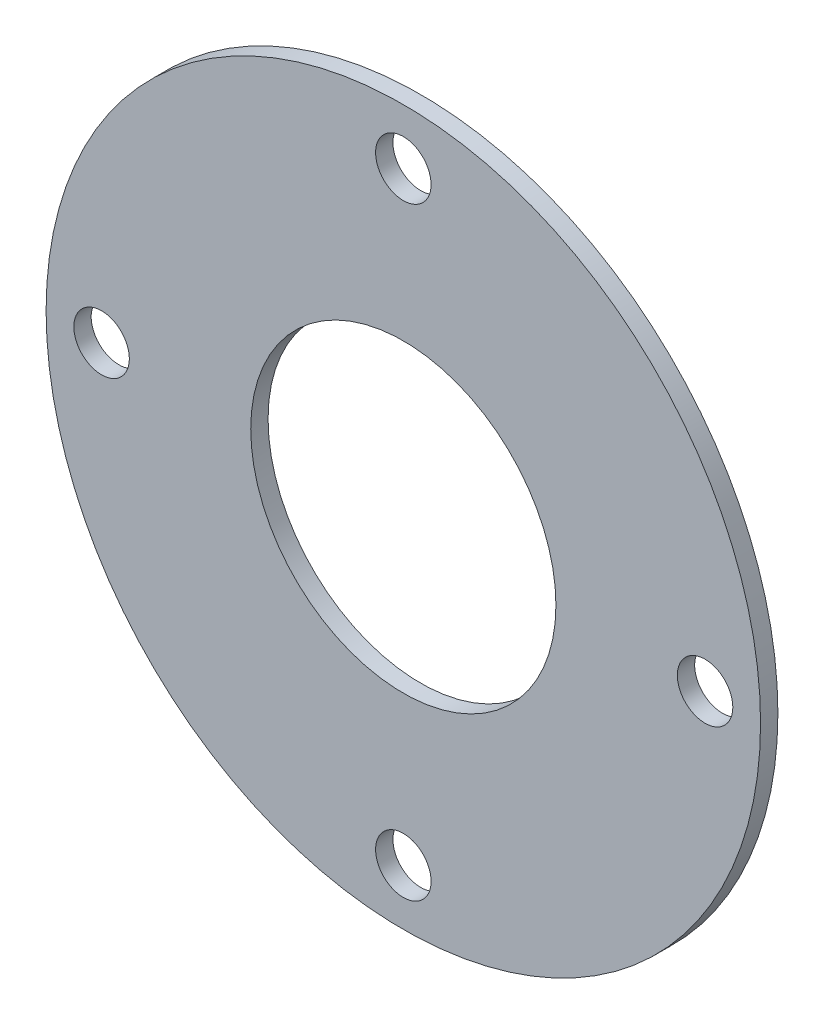
ISO-10303-21;
HEADER;
FILE_DESCRIPTION(('STEP AP214'),'2;1');
FILE_NAME('part.step','',(''),(''),'','','');
FILE_SCHEMA(('AUTOMOTIVE_DESIGN { 1 0 10303 214 1 1 1 1 }'));
ENDSEC;
DATA;
#1=APPLICATION_CONTEXT('core data for automotive mechanical design processes');
#2=APPLICATION_PROTOCOL_DEFINITION('international standard','automotive_design',2000,#1);
#3=PRODUCT_CONTEXT('',#1,'mechanical');
#4=PRODUCT('Part','Part','',(#3));
#5=PRODUCT_RELATED_PRODUCT_CATEGORY('part','',(#4));
#6=PRODUCT_DEFINITION_FORMATION('','',#4);
#7=PRODUCT_DEFINITION_CONTEXT('part definition',#1,'design');
#8=PRODUCT_DEFINITION('design','',#6,#7);
#9=PRODUCT_DEFINITION_SHAPE('','',#8);
#10=(LENGTH_UNIT() NAMED_UNIT(*) SI_UNIT(.MILLI.,.METRE.));
#11=(NAMED_UNIT(*) PLANE_ANGLE_UNIT() SI_UNIT($,.RADIAN.));
#12=(NAMED_UNIT(*) SI_UNIT($,.STERADIAN.) SOLID_ANGLE_UNIT());
#13=UNCERTAINTY_MEASURE_WITH_UNIT(LENGTH_MEASURE(1.E-05),#10,'distance_accuracy_value','');
#14=(GEOMETRIC_REPRESENTATION_CONTEXT(3) GLOBAL_UNCERTAINTY_ASSIGNED_CONTEXT((#13)) GLOBAL_UNIT_ASSIGNED_CONTEXT((#10,
#11,#12)) REPRESENTATION_CONTEXT('',''));
#15=CARTESIAN_POINT('',(0.,0.,0.));
#16=DIRECTION('',(0.,0.,1.));
#17=DIRECTION('',(1.,0.,0.));
#18=AXIS2_PLACEMENT_3D('',#15,#16,#17);
#19=CARTESIAN_POINT('',(0.,0.,29.5));
#20=DIRECTION('',(0.,0.,1.));
#21=DIRECTION('',(1.,0.,0.));
#22=AXIS2_PLACEMENT_3D('',#19,#20,#21);
#23=PLANE('',#22);
#24=CARTESIAN_POINT('',(43.5,0.,29.5));
#25=DIRECTION('',(0.,0.,1.));
#26=DIRECTION('',(1.,0.,0.));
#27=AXIS2_PLACEMENT_3D('',#24,#25,#26);
#28=CIRCLE('',#27,4.);
#29=CARTESIAN_POINT('',(47.5,0.,29.5));
#30=VERTEX_POINT('',#29);
#31=EDGE_CURVE('E85',#30,#30,#28,.T.);
#32=ORIENTED_EDGE('',*,*,#31,.F.);
#33=EDGE_LOOP('',(#32));
#34=FACE_BOUND('',#33,.T.);
#35=CARTESIAN_POINT('',(0.,43.5,29.5));
#36=DIRECTION('',(0.,0.,1.));
#37=DIRECTION('',(1.,0.,0.));
#38=AXIS2_PLACEMENT_3D('',#35,#36,#37);
#39=CIRCLE('',#38,4.);
#40=CARTESIAN_POINT('',(4.,43.5,29.5));
#41=VERTEX_POINT('',#40);
#42=EDGE_CURVE('E69',#41,#41,#39,.T.);
#43=ORIENTED_EDGE('',*,*,#42,.F.);
#44=EDGE_LOOP('',(#43));
#45=FACE_BOUND('',#44,.T.);
#46=CARTESIAN_POINT('',(-43.5,0.,29.5));
#47=DIRECTION('',(0.,0.,1.));
#48=DIRECTION('',(1.,0.,0.));
#49=AXIS2_PLACEMENT_3D('',#46,#47,#48);
#50=CIRCLE('',#49,4.);
#51=CARTESIAN_POINT('',(-39.5,0.,29.5));
#52=VERTEX_POINT('',#51);
#53=EDGE_CURVE('E65',#52,#52,#50,.T.);
#54=ORIENTED_EDGE('',*,*,#53,.F.);
#55=EDGE_LOOP('',(#54));
#56=FACE_BOUND('',#55,.T.);
#57=CARTESIAN_POINT('',(0.,-43.5,29.5));
#58=DIRECTION('',(0.,0.,1.));
#59=DIRECTION('',(1.,0.,0.));
#60=AXIS2_PLACEMENT_3D('',#57,#58,#59);
#61=CIRCLE('',#60,4.);
#62=CARTESIAN_POINT('',(3.99999999999999,-43.5,29.5));
#63=VERTEX_POINT('',#62);
#64=EDGE_CURVE('E62',#63,#63,#61,.T.);
#65=ORIENTED_EDGE('',*,*,#64,.F.);
#66=EDGE_LOOP('',(#65));
#67=FACE_BOUND('',#66,.T.);
#68=CARTESIAN_POINT('',(0.,0.,29.5));
#69=DIRECTION('',(0.,0.,1.));
#70=DIRECTION('',(1.,0.,0.));
#71=AXIS2_PLACEMENT_3D('',#68,#69,#70);
#72=CIRCLE('',#71,51.5);
#73=CARTESIAN_POINT('',(51.5,0.,29.5));
#74=VERTEX_POINT('',#73);
#75=EDGE_CURVE('E10',#74,#74,#72,.T.);
#76=ORIENTED_EDGE('',*,*,#75,.T.);
#77=EDGE_LOOP('',(#76));
#78=FACE_BOUND('',#77,.T.);
#79=CARTESIAN_POINT('',(0.,0.,29.5));
#80=DIRECTION('',(0.,0.,1.));
#81=DIRECTION('',(1.,0.,0.));
#82=AXIS2_PLACEMENT_3D('',#79,#80,#81);
#83=CIRCLE('',#82,22.);
#84=CARTESIAN_POINT('',(22.,0.,29.5));
#85=VERTEX_POINT('',#84);
#86=EDGE_CURVE('E53',#85,#85,#83,.T.);
#87=ORIENTED_EDGE('',*,*,#86,.F.);
#88=EDGE_LOOP('',(#87));
#89=FACE_BOUND('',#88,.T.);
#90=ADVANCED_FACE('F36',(#34,#45,#56,#67,#78,#89),#23,.T.);
#91=CARTESIAN_POINT('',(0.,0.,27.));
#92=DIRECTION('',(0.,0.,1.));
#93=DIRECTION('',(1.,0.,0.));
#94=AXIS2_PLACEMENT_3D('',#91,#92,#93);
#95=PLANE('',#94);
#96=CARTESIAN_POINT('',(43.5,0.,27.));
#97=DIRECTION('',(0.,0.,1.));
#98=DIRECTION('',(1.,0.,0.));
#99=AXIS2_PLACEMENT_3D('',#96,#97,#98);
#100=CIRCLE('',#99,4.);
#101=CARTESIAN_POINT('',(47.5,0.,27.));
#102=VERTEX_POINT('',#101);
#103=EDGE_CURVE('E40',#102,#102,#100,.T.);
#104=ORIENTED_EDGE('',*,*,#103,.T.);
#105=EDGE_LOOP('',(#104));
#106=FACE_BOUND('',#105,.T.);
#107=CARTESIAN_POINT('',(0.,43.5,27.));
#108=DIRECTION('',(0.,0.,1.));
#109=DIRECTION('',(1.,0.,0.));
#110=AXIS2_PLACEMENT_3D('',#107,#108,#109);
#111=CIRCLE('',#110,4.);
#112=CARTESIAN_POINT('',(4.,43.5,27.));
#113=VERTEX_POINT('',#112);
#114=EDGE_CURVE('E66',#113,#113,#111,.T.);
#115=ORIENTED_EDGE('',*,*,#114,.T.);
#116=EDGE_LOOP('',(#115));
#117=FACE_BOUND('',#116,.T.);
#118=CARTESIAN_POINT('',(-43.5,0.,27.));
#119=DIRECTION('',(0.,0.,1.));
#120=DIRECTION('',(1.,0.,0.));
#121=AXIS2_PLACEMENT_3D('',#118,#119,#120);
#122=CIRCLE('',#121,4.);
#123=CARTESIAN_POINT('',(-39.5,0.,27.));
#124=VERTEX_POINT('',#123);
#125=EDGE_CURVE('E63',#124,#124,#122,.T.);
#126=ORIENTED_EDGE('',*,*,#125,.T.);
#127=EDGE_LOOP('',(#126));
#128=FACE_BOUND('',#127,.T.);
#129=CARTESIAN_POINT('',(0.,-43.5,27.));
#130=DIRECTION('',(0.,0.,1.));
#131=DIRECTION('',(1.,0.,0.));
#132=AXIS2_PLACEMENT_3D('',#129,#130,#131);
#133=CIRCLE('',#132,4.);
#134=CARTESIAN_POINT('',(3.99999999999999,-43.5,27.));
#135=VERTEX_POINT('',#134);
#136=EDGE_CURVE('E59',#135,#135,#133,.T.);
#137=ORIENTED_EDGE('',*,*,#136,.T.);
#138=EDGE_LOOP('',(#137));
#139=FACE_BOUND('',#138,.T.);
#140=CARTESIAN_POINT('',(0.,0.,27.));
#141=DIRECTION('',(0.,0.,1.));
#142=DIRECTION('',(1.,0.,0.));
#143=AXIS2_PLACEMENT_3D('',#140,#141,#142);
#144=CIRCLE('',#143,51.5);
#145=CARTESIAN_POINT('',(51.5,0.,27.));
#146=VERTEX_POINT('',#145);
#147=EDGE_CURVE('E45',#146,#146,#144,.T.);
#148=ORIENTED_EDGE('',*,*,#147,.F.);
#149=EDGE_LOOP('',(#148));
#150=FACE_BOUND('',#149,.T.);
#151=CARTESIAN_POINT('',(0.,0.,27.));
#152=DIRECTION('',(0.,0.,1.));
#153=DIRECTION('',(1.,0.,0.));
#154=AXIS2_PLACEMENT_3D('',#151,#152,#153);
#155=CIRCLE('',#154,22.);
#156=CARTESIAN_POINT('',(22.,0.,27.));
#157=VERTEX_POINT('',#156);
#158=EDGE_CURVE('E56',#157,#157,#155,.T.);
#159=ORIENTED_EDGE('',*,*,#158,.T.);
#160=EDGE_LOOP('',(#159));
#161=FACE_BOUND('',#160,.T.);
#162=ADVANCED_FACE('F95',(#106,#117,#128,#139,#150,#161),#95,.F.);
#163=CARTESIAN_POINT('',(0.,0.,29.5));
#164=DIRECTION('',(0.,0.,-1.));
#165=DIRECTION('',(-1.,0.,0.));
#166=AXIS2_PLACEMENT_3D('',#163,#164,#165);
#167=CYLINDRICAL_SURFACE('',#166,51.5);
#168=ORIENTED_EDGE('',*,*,#75,.F.);
#169=EDGE_LOOP('',(#168));
#170=FACE_BOUND('',#169,.T.);
#171=ORIENTED_EDGE('',*,*,#147,.T.);
#172=EDGE_LOOP('',(#171));
#173=FACE_BOUND('',#172,.T.);
#174=ADVANCED_FACE('F38',(#170,#173),#167,.T.);
#175=CARTESIAN_POINT('',(0.,0.,29.5));
#176=DIRECTION('',(0.,0.,-1.));
#177=DIRECTION('',(-1.,0.,0.));
#178=AXIS2_PLACEMENT_3D('',#175,#176,#177);
#179=CYLINDRICAL_SURFACE('',#178,22.);
#180=ORIENTED_EDGE('',*,*,#86,.T.);
#181=EDGE_LOOP('',(#180));
#182=FACE_BOUND('',#181,.T.);
#183=ORIENTED_EDGE('',*,*,#158,.F.);
#184=EDGE_LOOP('',(#183));
#185=FACE_BOUND('',#184,.T.);
#186=ADVANCED_FACE('F97',(#182,#185),#179,.F.);
#187=CARTESIAN_POINT('',(0.,-43.5,-100.));
#188=DIRECTION('',(0.,0.,1.));
#189=DIRECTION('',(1.,0.,0.));
#190=AXIS2_PLACEMENT_3D('',#187,#188,#189);
#191=CYLINDRICAL_SURFACE('',#190,4.);
#192=ORIENTED_EDGE('',*,*,#64,.T.);
#193=EDGE_LOOP('',(#192));
#194=FACE_BOUND('',#193,.T.);
#195=ORIENTED_EDGE('',*,*,#136,.F.);
#196=EDGE_LOOP('',(#195));
#197=FACE_BOUND('',#196,.T.);
#198=ADVANCED_FACE('F99',(#194,#197),#191,.F.);
#199=CARTESIAN_POINT('',(-43.5,0.,-100.));
#200=DIRECTION('',(0.,0.,1.));
#201=DIRECTION('',(1.,0.,0.));
#202=AXIS2_PLACEMENT_3D('',#199,#200,#201);
#203=CYLINDRICAL_SURFACE('',#202,4.);
#204=ORIENTED_EDGE('',*,*,#53,.T.);
#205=EDGE_LOOP('',(#204));
#206=FACE_BOUND('',#205,.T.);
#207=ORIENTED_EDGE('',*,*,#125,.F.);
#208=EDGE_LOOP('',(#207));
#209=FACE_BOUND('',#208,.T.);
#210=ADVANCED_FACE('F105',(#206,#209),#203,.F.);
#211=CARTESIAN_POINT('',(0.,43.5,-100.));
#212=DIRECTION('',(0.,0.,1.));
#213=DIRECTION('',(1.,0.,0.));
#214=AXIS2_PLACEMENT_3D('',#211,#212,#213);
#215=CYLINDRICAL_SURFACE('',#214,4.);
#216=ORIENTED_EDGE('',*,*,#42,.T.);
#217=EDGE_LOOP('',(#216));
#218=FACE_BOUND('',#217,.T.);
#219=ORIENTED_EDGE('',*,*,#114,.F.);
#220=EDGE_LOOP('',(#219));
#221=FACE_BOUND('',#220,.T.);
#222=ADVANCED_FACE('F129',(#218,#221),#215,.F.);
#223=CARTESIAN_POINT('',(43.5,0.,-100.));
#224=DIRECTION('',(0.,0.,1.));
#225=DIRECTION('',(1.,0.,0.));
#226=AXIS2_PLACEMENT_3D('',#223,#224,#225);
#227=CYLINDRICAL_SURFACE('',#226,4.);
#228=ORIENTED_EDGE('',*,*,#31,.T.);
#229=EDGE_LOOP('',(#228));
#230=FACE_BOUND('',#229,.T.);
#231=ORIENTED_EDGE('',*,*,#103,.F.);
#232=EDGE_LOOP('',(#231));
#233=FACE_BOUND('',#232,.T.);
#234=ADVANCED_FACE('F127',(#230,#233),#227,.F.);
#235=CLOSED_SHELL('',(#90,#162,#174,#186,#198,#210,#222,#234));
#236=MANIFOLD_SOLID_BREP('B2',#235);
#237=ADVANCED_BREP_SHAPE_REPRESENTATION('',(#18,#236),#14);
#238=SHAPE_DEFINITION_REPRESENTATION(#9,#237);
ENDSEC;
END-ISO-10303-21;
